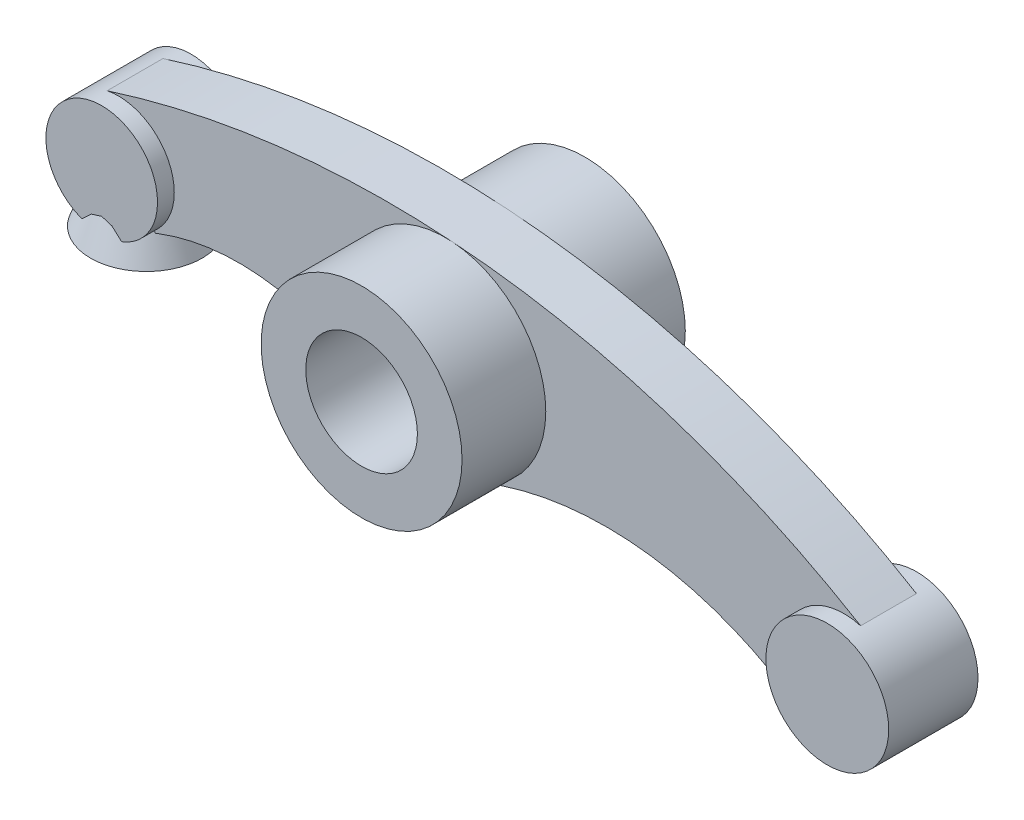
ISO-10303-21;
HEADER;
FILE_DESCRIPTION(('STEP AP214'),'2;1');
FILE_NAME('part.step','',(''),(''),'','','');
FILE_SCHEMA(('AUTOMOTIVE_DESIGN { 1 0 10303 214 1 1 1 1 }'));
ENDSEC;
DATA;
#1=APPLICATION_CONTEXT('core data for automotive mechanical design processes');
#2=APPLICATION_PROTOCOL_DEFINITION('international standard','automotive_design',2000,#1);
#3=PRODUCT_CONTEXT('',#1,'mechanical');
#4=PRODUCT('Part','Part','',(#3));
#5=PRODUCT_RELATED_PRODUCT_CATEGORY('part','',(#4));
#6=PRODUCT_DEFINITION_FORMATION('','',#4);
#7=PRODUCT_DEFINITION_CONTEXT('part definition',#1,'design');
#8=PRODUCT_DEFINITION('design','',#6,#7);
#9=PRODUCT_DEFINITION_SHAPE('','',#8);
#10=(LENGTH_UNIT() NAMED_UNIT(*) SI_UNIT(.MILLI.,.METRE.));
#11=(NAMED_UNIT(*) PLANE_ANGLE_UNIT() SI_UNIT($,.RADIAN.));
#12=(NAMED_UNIT(*) SI_UNIT($,.STERADIAN.) SOLID_ANGLE_UNIT());
#13=UNCERTAINTY_MEASURE_WITH_UNIT(LENGTH_MEASURE(1.E-05),#10,'distance_accuracy_value','');
#14=(GEOMETRIC_REPRESENTATION_CONTEXT(3) GLOBAL_UNCERTAINTY_ASSIGNED_CONTEXT((#13)) GLOBAL_UNIT_ASSIGNED_CONTEXT((#10,
#11,#12)) REPRESENTATION_CONTEXT('',''));
#15=CARTESIAN_POINT('',(0.,0.,0.));
#16=DIRECTION('',(0.,0.,1.));
#17=DIRECTION('',(1.,0.,0.));
#18=AXIS2_PLACEMENT_3D('',#15,#16,#17);
#19=CARTESIAN_POINT('',(-29.2802079968478,-6.,0.));
#20=DIRECTION('',(0.,-1.,0.));
#21=DIRECTION('',(0.,0.,1.));
#22=AXIS2_PLACEMENT_3D('',#19,#20,#21);
#23=CONICAL_SURFACE('',#22,5.,0.349065850398868);
#24=CARTESIAN_POINT('',(-29.2802079968478,1.,0.));
#25=DIRECTION('',(0.,1.,0.));
#26=DIRECTION('',(0.,0.,1.));
#27=AXIS2_PLACEMENT_3D('',#24,#25,#26);
#28=CIRCLE('',#27,2.45220836013657);
#29=CARTESIAN_POINT('',(-29.2802079968478,1.,2.45220836013657));
#30=VERTEX_POINT('',#29);
#31=EDGE_CURVE('E11',#30,#30,#28,.T.);
#32=ORIENTED_EDGE('',*,*,#31,.F.);
#33=EDGE_LOOP('',(#32));
#34=FACE_BOUND('',#33,.T.);
#35=CARTESIAN_POINT('',(-29.2802079968478,-6.,0.));
#36=DIRECTION('',(0.,1.,0.));
#37=DIRECTION('',(0.,0.,1.));
#38=AXIS2_PLACEMENT_3D('',#35,#36,#37);
#39=CIRCLE('',#38,5.);
#40=CARTESIAN_POINT('',(-29.2802079968478,-6.,5.));
#41=VERTEX_POINT('',#40);
#42=EDGE_CURVE('E52',#41,#41,#39,.T.);
#43=ORIENTED_EDGE('',*,*,#42,.T.);
#44=EDGE_LOOP('',(#43));
#45=FACE_BOUND('',#44,.T.);
#46=ADVANCED_FACE('F46',(#34,#45),#23,.T.);
#47=CARTESIAN_POINT('',(-29.2802079968478,1.,0.));
#48=DIRECTION('',(0.,1.,0.));
#49=DIRECTION('',(0.,0.,1.));
#50=AXIS2_PLACEMENT_3D('',#47,#48,#49);
#51=PLANE('',#50);
#52=ORIENTED_EDGE('',*,*,#31,.T.);
#53=EDGE_LOOP('',(#52));
#54=FACE_BOUND('',#53,.T.);
#55=ADVANCED_FACE('F61',(#54),#51,.T.);
#56=CARTESIAN_POINT('',(-29.2802079968478,-6.,0.));
#57=DIRECTION('',(0.,1.,0.));
#58=DIRECTION('',(0.,0.,1.));
#59=AXIS2_PLACEMENT_3D('',#56,#57,#58);
#60=PLANE('',#59);
#61=ORIENTED_EDGE('',*,*,#42,.F.);
#62=EDGE_LOOP('',(#61));
#63=FACE_BOUND('',#62,.T.);
#64=ADVANCED_FACE('F59',(#63),#60,.F.);
#65=CLOSED_SHELL('',(#46,#55,#64));
#66=MANIFOLD_SOLID_BREP('B2',#65);
#67=CARTESIAN_POINT('',(-5.1144524966079,-73.1815002282677,2.5));
#68=DIRECTION('',(0.,0.,-1.));
#69=DIRECTION('',(-1.,0.,0.));
#70=AXIS2_PLACEMENT_3D('',#67,#68,#69);
#71=CYLINDRICAL_SURFACE('',#70,82.36);
#72=CARTESIAN_POINT('',(-5.1144524966079,-73.1815002282677,-2.5));
#73=DIRECTION('',(0.,0.,1.));
#74=DIRECTION('',(1.,0.,0.));
#75=AXIS2_PLACEMENT_3D('',#72,#73,#74);
#76=CIRCLE('',#75,82.36);
#77=CARTESIAN_POINT('',(-30.2955174092308,5.2345923157138,-2.5));
#78=VERTEX_POINT('',#77);
#79=CARTESIAN_POINT('',(0.627454641077849,8.97810117304262,-2.5));
#80=VERTEX_POINT('',#79);
#81=EDGE_CURVE('E182',#78,#80,#76,.F.);
#82=ORIENTED_EDGE('',*,*,#81,.F.);
#83=DIRECTION('',(0.,0.,-1.));
#84=VECTOR('',#83,1.);
#85=CARTESIAN_POINT('',(-30.2955174092308,5.23459231571385,0.));
#86=LINE('',#85,#84);
#87=CARTESIAN_POINT('',(-30.2955174092308,5.2345923157138,2.5));
#88=VERTEX_POINT('',#87);
#89=EDGE_CURVE('E44',#78,#88,#86,.F.);
#90=ORIENTED_EDGE('',*,*,#89,.T.);
#91=CARTESIAN_POINT('',(-5.1144524966079,-73.1815002282677,2.5));
#92=DIRECTION('',(0.,0.,1.));
#93=DIRECTION('',(1.,0.,0.));
#94=AXIS2_PLACEMENT_3D('',#91,#92,#93);
#95=CIRCLE('',#94,82.36);
#96=CARTESIAN_POINT('',(0.627454641077849,8.97810117304262,2.5));
#97=VERTEX_POINT('',#96);
#98=EDGE_CURVE('E100',#88,#97,#95,.F.);
#99=ORIENTED_EDGE('',*,*,#98,.T.);
#100=CARTESIAN_POINT('',(37.2052077756992,-2.52588506261709,2.5));
#101=VERTEX_POINT('',#100);
#102=EDGE_CURVE('E187',#97,#101,#95,.F.);
#103=ORIENTED_EDGE('',*,*,#102,.T.);
#104=DIRECTION('',(0.,0.,-1.));
#105=VECTOR('',#104,1.);
#106=CARTESIAN_POINT('',(37.2052077756991,-2.52588506261706,2.5));
#107=LINE('',#106,#105);
#108=CARTESIAN_POINT('',(37.2052077756991,-2.52588506261706,-2.5));
#109=VERTEX_POINT('',#108);
#110=EDGE_CURVE('E177',#101,#109,#107,.T.);
#111=ORIENTED_EDGE('',*,*,#110,.T.);
#112=EDGE_CURVE('E184',#80,#109,#76,.F.);
#113=ORIENTED_EDGE('',*,*,#112,.F.);
#114=EDGE_LOOP('',(#82,#90,#99,#103,#111,#113));
#115=FACE_BOUND('',#114,.T.);
#116=ADVANCED_FACE('F86',(#115),#71,.T.);
#117=CARTESIAN_POINT('',(0.,0.,2.5));
#118=DIRECTION('',(0.,0.,1.));
#119=DIRECTION('',(1.,0.,0.));
#120=AXIS2_PLACEMENT_3D('',#117,#118,#119);
#121=PLANE('',#120);
#122=CARTESIAN_POINT('',(14.4326611027123,-36.2311474986499,2.5));
#123=DIRECTION('',(0.,0.,1.));
#124=DIRECTION('',(1.,0.,0.));
#125=AXIS2_PLACEMENT_3D('',#122,#123,#124);
#126=CIRCLE('',#125,30.);
#127=CARTESIAN_POINT('',(32.4217858073094,-12.2229948757917,2.5));
#128=VERTEX_POINT('',#127);
#129=CARTESIAN_POINT('',(3.34915168821614,-8.3536329204316,2.5));
#130=VERTEX_POINT('',#129);
#131=EDGE_CURVE('E188',#128,#130,#126,.T.);
#132=ORIENTED_EDGE('',*,*,#131,.F.);
#133=CARTESIAN_POINT('',(35.7197920031522,-7.82150022826769,2.5));
#134=DIRECTION('',(0.,0.,1.));
#135=DIRECTION('',(1.,0.,0.));
#136=AXIS2_PLACEMENT_3D('',#133,#134,#135);
#137=CIRCLE('',#136,5.5);
#138=EDGE_CURVE('E207',#128,#101,#137,.F.);
#139=ORIENTED_EDGE('',*,*,#138,.T.);
#140=ORIENTED_EDGE('',*,*,#102,.F.);
#141=CARTESIAN_POINT('',(0.,0.,2.5));
#142=DIRECTION('',(0.,0.,1.));
#143=DIRECTION('',(1.,0.,0.));
#144=AXIS2_PLACEMENT_3D('',#141,#142,#143);
#145=CIRCLE('',#144,8.99999999999997);
#146=EDGE_CURVE('E108',#97,#130,#145,.F.);
#147=ORIENTED_EDGE('',*,*,#146,.T.);
#148=EDGE_LOOP('',(#132,#139,#140,#147));
#149=FACE_BOUND('',#148,.T.);
#150=ADVANCED_FACE('F243',(#149),#121,.T.);
#151=CARTESIAN_POINT('',(0.,0.,-2.5));
#152=DIRECTION('',(0.,0.,1.));
#153=DIRECTION('',(1.,0.,0.));
#154=AXIS2_PLACEMENT_3D('',#151,#152,#153);
#155=PLANE('',#154);
#156=CARTESIAN_POINT('',(35.7197920031522,-7.82150022826769,-2.5));
#157=DIRECTION('',(0.,0.,1.));
#158=DIRECTION('',(1.,0.,0.));
#159=AXIS2_PLACEMENT_3D('',#156,#157,#158);
#160=CIRCLE('',#159,5.5);
#161=CARTESIAN_POINT('',(32.4217858073094,-12.2229948757917,-2.5));
#162=VERTEX_POINT('',#161);
#163=EDGE_CURVE('E212',#162,#109,#160,.F.);
#164=ORIENTED_EDGE('',*,*,#163,.F.);
#165=CARTESIAN_POINT('',(14.4326611027123,-36.2311474986499,-2.5));
#166=DIRECTION('',(0.,0.,1.));
#167=DIRECTION('',(1.,0.,0.));
#168=AXIS2_PLACEMENT_3D('',#165,#166,#167);
#169=CIRCLE('',#168,30.);
#170=CARTESIAN_POINT('',(3.34915168821614,-8.3536329204316,-2.5));
#171=VERTEX_POINT('',#170);
#172=EDGE_CURVE('E165',#162,#171,#169,.T.);
#173=ORIENTED_EDGE('',*,*,#172,.T.);
#174=CARTESIAN_POINT('',(0.,0.,-2.5));
#175=DIRECTION('',(0.,0.,1.));
#176=DIRECTION('',(1.,0.,0.));
#177=AXIS2_PLACEMENT_3D('',#174,#175,#176);
#178=CIRCLE('',#177,8.99999999999997);
#179=EDGE_CURVE('E172',#80,#171,#178,.F.);
#180=ORIENTED_EDGE('',*,*,#179,.F.);
#181=ORIENTED_EDGE('',*,*,#112,.T.);
#182=EDGE_LOOP('',(#164,#173,#180,#181));
#183=FACE_BOUND('',#182,.T.);
#184=ADVANCED_FACE('F248',(#183),#155,.F.);
#185=CARTESIAN_POINT('',(-18.4794070711714,-22.2076936855671,2.5));
#186=DIRECTION('',(0.,0.,-1.));
#187=DIRECTION('',(-1.,0.,0.));
#188=AXIS2_PLACEMENT_3D('',#185,#186,#187);
#189=CYLINDRICAL_SURFACE('',#188,20.);
#190=DIRECTION('',(0.,0.,-1.));
#191=VECTOR('',#190,1.);
#192=CARTESIAN_POINT('',(-6.60254719634098,-6.11607476410232,0.));
#193=LINE('',#192,#191);
#194=CARTESIAN_POINT('',(-6.60254719634098,-6.11607476410232,2.5));
#195=VERTEX_POINT('',#194);
#196=CARTESIAN_POINT('',(-6.60254719634098,-6.11607476410232,-2.5));
#197=VERTEX_POINT('',#196);
#198=EDGE_CURVE('E192',#195,#197,#193,.T.);
#199=ORIENTED_EDGE('',*,*,#198,.F.);
#200=CARTESIAN_POINT('',(-18.4794070711714,-22.2076936855671,2.5));
#201=DIRECTION('',(0.,0.,1.));
#202=DIRECTION('',(1.,0.,0.));
#203=AXIS2_PLACEMENT_3D('',#200,#201,#202);
#204=CIRCLE('',#203,20.);
#205=CARTESIAN_POINT('',(-27.1200478117125,-4.17052850938435,2.5));
#206=VERTEX_POINT('',#205);
#207=EDGE_CURVE('E171',#206,#195,#204,.F.);
#208=ORIENTED_EDGE('',*,*,#207,.F.);
#209=DIRECTION('',(0.,0.,-1.));
#210=VECTOR('',#209,1.);
#211=CARTESIAN_POINT('',(-27.1200478117125,-4.17052850938431,2.5));
#212=LINE('',#211,#210);
#213=CARTESIAN_POINT('',(-27.1200478117125,-4.17052850938435,-2.5));
#214=VERTEX_POINT('',#213);
#215=EDGE_CURVE('E153',#206,#214,#212,.T.);
#216=ORIENTED_EDGE('',*,*,#215,.T.);
#217=CARTESIAN_POINT('',(-18.4794070711714,-22.2076936855671,-2.5));
#218=DIRECTION('',(0.,0.,1.));
#219=DIRECTION('',(1.,0.,0.));
#220=AXIS2_PLACEMENT_3D('',#217,#218,#219);
#221=CIRCLE('',#220,20.);
#222=EDGE_CURVE('E160',#214,#197,#221,.F.);
#223=ORIENTED_EDGE('',*,*,#222,.T.);
#224=EDGE_LOOP('',(#199,#208,#216,#223));
#225=FACE_BOUND('',#224,.T.);
#226=ADVANCED_FACE('F169',(#225),#189,.F.);
#227=CARTESIAN_POINT('',(14.4326611027123,-36.2311474986499,2.5));
#228=DIRECTION('',(0.,0.,-1.));
#229=DIRECTION('',(-1.,0.,0.));
#230=AXIS2_PLACEMENT_3D('',#227,#228,#229);
#231=CYLINDRICAL_SURFACE('',#230,30.);
#232=ORIENTED_EDGE('',*,*,#131,.T.);
#233=DIRECTION('',(0.,0.,-1.));
#234=VECTOR('',#233,1.);
#235=CARTESIAN_POINT('',(3.34915168821614,-8.35363292043159,0.));
#236=LINE('',#235,#234);
#237=EDGE_CURVE('E194',#130,#171,#236,.T.);
#238=ORIENTED_EDGE('',*,*,#237,.T.);
#239=ORIENTED_EDGE('',*,*,#172,.F.);
#240=DIRECTION('',(0.,0.,-1.));
#241=VECTOR('',#240,1.);
#242=CARTESIAN_POINT('',(32.4217858073094,-12.2229948757917,2.5));
#243=LINE('',#242,#241);
#244=EDGE_CURVE('E173',#128,#162,#243,.T.);
#245=ORIENTED_EDGE('',*,*,#244,.F.);
#246=EDGE_LOOP('',(#232,#238,#239,#245));
#247=FACE_BOUND('',#246,.T.);
#248=ADVANCED_FACE('F257',(#247),#231,.F.);
#249=ORIENTED_EDGE('',*,*,#98,.F.);
#250=CARTESIAN_POINT('',(-29.2802079968478,0.338762784661341,2.5));
#251=DIRECTION('',(0.,0.,1.));
#252=DIRECTION('',(1.,0.,0.));
#253=AXIS2_PLACEMENT_3D('',#250,#251,#252);
#254=CIRCLE('',#253,4.99999999999995);
#255=EDGE_CURVE('E156',#88,#206,#254,.F.);
#256=ORIENTED_EDGE('',*,*,#255,.T.);
#257=ORIENTED_EDGE('',*,*,#207,.T.);
#258=EDGE_CURVE('E166',#195,#97,#145,.F.);
#259=ORIENTED_EDGE('',*,*,#258,.T.);
#260=EDGE_LOOP('',(#249,#256,#257,#259));
#261=FACE_BOUND('',#260,.T.);
#262=ADVANCED_FACE('F250',(#261),#121,.T.);
#263=CARTESIAN_POINT('',(-29.2802079968478,0.338762784661341,-2.5));
#264=DIRECTION('',(0.,0.,1.));
#265=DIRECTION('',(1.,0.,0.));
#266=AXIS2_PLACEMENT_3D('',#263,#264,#265);
#267=CIRCLE('',#266,4.99999999999995);
#268=EDGE_CURVE('E148',#78,#214,#267,.F.);
#269=ORIENTED_EDGE('',*,*,#268,.F.);
#270=ORIENTED_EDGE('',*,*,#81,.T.);
#271=EDGE_CURVE('E94',#197,#80,#178,.F.);
#272=ORIENTED_EDGE('',*,*,#271,.F.);
#273=ORIENTED_EDGE('',*,*,#222,.F.);
#274=EDGE_LOOP('',(#269,#270,#272,#273));
#275=FACE_BOUND('',#274,.T.);
#276=ADVANCED_FACE('F161',(#275),#155,.F.);
#277=CARTESIAN_POINT('',(-29.2802079968478,0.338762784661341,2.5));
#278=DIRECTION('',(0.,0.,-1.));
#279=DIRECTION('',(-1.,0.,0.));
#280=AXIS2_PLACEMENT_3D('',#277,#278,#279);
#281=CYLINDRICAL_SURFACE('',#280,4.99999999999995);
#282=ORIENTED_EDGE('',*,*,#215,.F.);
#283=ORIENTED_EDGE('',*,*,#255,.F.);
#284=ORIENTED_EDGE('',*,*,#89,.F.);
#285=ORIENTED_EDGE('',*,*,#268,.T.);
#286=EDGE_LOOP('',(#282,#283,#284,#285));
#287=FACE_BOUND('',#286,.T.);
#288=CARTESIAN_POINT('',(-29.2802079968478,0.338762784661341,4.));
#289=DIRECTION('',(0.,0.,1.));
#290=DIRECTION('',(1.,0.,0.));
#291=AXIS2_PLACEMENT_3D('',#288,#289,#290);
#292=CIRCLE('',#291,4.99999999999995);
#293=CARTESIAN_POINT('',(-24.2802079968478,0.338762784661341,4.));
#294=VERTEX_POINT('',#293);
#295=EDGE_CURVE('E157',#294,#294,#292,.T.);
#296=ORIENTED_EDGE('',*,*,#295,.F.);
#297=EDGE_LOOP('',(#296));
#298=FACE_BOUND('',#297,.T.);
#299=CARTESIAN_POINT('',(-29.2802079968478,0.338762784661341,-4.));
#300=DIRECTION('',(0.,0.,1.));
#301=DIRECTION('',(1.,0.,0.));
#302=AXIS2_PLACEMENT_3D('',#299,#300,#301);
#303=CIRCLE('',#302,4.99999999999995);
#304=CARTESIAN_POINT('',(-24.2802079968478,0.338762784661341,-4.));
#305=VERTEX_POINT('',#304);
#306=EDGE_CURVE('E221',#305,#305,#303,.T.);
#307=ORIENTED_EDGE('',*,*,#306,.T.);
#308=EDGE_LOOP('',(#307));
#309=FACE_BOUND('',#308,.T.);
#310=ADVANCED_FACE('F150',(#287,#298,#309),#281,.T.);
#311=CARTESIAN_POINT('',(35.7197920031522,-7.82150022826769,2.5));
#312=DIRECTION('',(0.,0.,-1.));
#313=DIRECTION('',(-1.,0.,0.));
#314=AXIS2_PLACEMENT_3D('',#311,#312,#313);
#315=CYLINDRICAL_SURFACE('',#314,5.5);
#316=ORIENTED_EDGE('',*,*,#244,.T.);
#317=ORIENTED_EDGE('',*,*,#163,.T.);
#318=ORIENTED_EDGE('',*,*,#110,.F.);
#319=ORIENTED_EDGE('',*,*,#138,.F.);
#320=EDGE_LOOP('',(#316,#317,#318,#319));
#321=FACE_BOUND('',#320,.T.);
#322=CARTESIAN_POINT('',(35.7197920031522,-7.82150022826769,-4.));
#323=DIRECTION('',(0.,0.,1.));
#324=DIRECTION('',(1.,0.,0.));
#325=AXIS2_PLACEMENT_3D('',#322,#323,#324);
#326=CIRCLE('',#325,5.5);
#327=CARTESIAN_POINT('',(41.2197920031522,-7.82150022826769,-4.));
#328=VERTEX_POINT('',#327);
#329=EDGE_CURVE('E215',#328,#328,#326,.T.);
#330=ORIENTED_EDGE('',*,*,#329,.T.);
#331=EDGE_LOOP('',(#330));
#332=FACE_BOUND('',#331,.T.);
#333=CARTESIAN_POINT('',(35.7197920031522,-7.82150022826769,4.));
#334=DIRECTION('',(0.,0.,1.));
#335=DIRECTION('',(1.,0.,0.));
#336=AXIS2_PLACEMENT_3D('',#333,#334,#335);
#337=CIRCLE('',#336,5.5);
#338=CARTESIAN_POINT('',(41.2197920031522,-7.82150022826769,4.));
#339=VERTEX_POINT('',#338);
#340=EDGE_CURVE('E214',#339,#339,#337,.T.);
#341=ORIENTED_EDGE('',*,*,#340,.F.);
#342=EDGE_LOOP('',(#341));
#343=FACE_BOUND('',#342,.T.);
#344=ADVANCED_FACE('F230',(#321,#332,#343),#315,.T.);
#345=CARTESIAN_POINT('',(0.,0.,10.));
#346=DIRECTION('',(0.,0.,1.));
#347=DIRECTION('',(1.,0.,0.));
#348=AXIS2_PLACEMENT_3D('',#345,#346,#347);
#349=PLANE('',#348);
#350=CARTESIAN_POINT('',(0.,0.,10.));
#351=DIRECTION('',(0.,0.,1.));
#352=DIRECTION('',(1.,0.,0.));
#353=AXIS2_PLACEMENT_3D('',#350,#351,#352);
#354=CIRCLE('',#353,8.99999999999997);
#355=CARTESIAN_POINT('',(8.99999999999997,0.,10.));
#356=VERTEX_POINT('',#355);
#357=EDGE_CURVE('E197',#356,#356,#354,.T.);
#358=ORIENTED_EDGE('',*,*,#357,.T.);
#359=EDGE_LOOP('',(#358));
#360=FACE_BOUND('',#359,.T.);
#361=CARTESIAN_POINT('',(0.,0.,10.));
#362=DIRECTION('',(0.,0.,1.));
#363=DIRECTION('',(1.,0.,0.));
#364=AXIS2_PLACEMENT_3D('',#361,#362,#363);
#365=CIRCLE('',#364,5.);
#366=CARTESIAN_POINT('',(5.,0.,10.));
#367=VERTEX_POINT('',#366);
#368=EDGE_CURVE('E201',#367,#367,#365,.T.);
#369=ORIENTED_EDGE('',*,*,#368,.F.);
#370=EDGE_LOOP('',(#369));
#371=FACE_BOUND('',#370,.T.);
#372=ADVANCED_FACE('F255',(#360,#371),#349,.T.);
#373=CARTESIAN_POINT('',(0.,0.,-10.));
#374=DIRECTION('',(0.,0.,1.));
#375=DIRECTION('',(1.,0.,0.));
#376=AXIS2_PLACEMENT_3D('',#373,#374,#375);
#377=PLANE('',#376);
#378=CARTESIAN_POINT('',(0.,0.,-10.));
#379=DIRECTION('',(0.,0.,1.));
#380=DIRECTION('',(1.,0.,0.));
#381=AXIS2_PLACEMENT_3D('',#378,#379,#380);
#382=CIRCLE('',#381,8.99999999999997);
#383=CARTESIAN_POINT('',(8.99999999999997,0.,-10.));
#384=VERTEX_POINT('',#383);
#385=EDGE_CURVE('E198',#384,#384,#382,.T.);
#386=ORIENTED_EDGE('',*,*,#385,.F.);
#387=EDGE_LOOP('',(#386));
#388=FACE_BOUND('',#387,.T.);
#389=CARTESIAN_POINT('',(0.,0.,-10.));
#390=DIRECTION('',(0.,0.,1.));
#391=DIRECTION('',(1.,0.,0.));
#392=AXIS2_PLACEMENT_3D('',#389,#390,#391);
#393=CIRCLE('',#392,5.);
#394=CARTESIAN_POINT('',(5.,0.,-10.));
#395=VERTEX_POINT('',#394);
#396=EDGE_CURVE('E204',#395,#395,#393,.T.);
#397=ORIENTED_EDGE('',*,*,#396,.T.);
#398=EDGE_LOOP('',(#397));
#399=FACE_BOUND('',#398,.T.);
#400=ADVANCED_FACE('F281',(#388,#399),#377,.F.);
#401=CARTESIAN_POINT('',(0.,0.,2.5));
#402=DIRECTION('',(0.,0.,-1.));
#403=DIRECTION('',(-1.,0.,0.));
#404=AXIS2_PLACEMENT_3D('',#401,#402,#403);
#405=CYLINDRICAL_SURFACE('',#404,5.);
#406=ORIENTED_EDGE('',*,*,#396,.F.);
#407=EDGE_LOOP('',(#406));
#408=FACE_BOUND('',#407,.T.);
#409=ORIENTED_EDGE('',*,*,#368,.T.);
#410=EDGE_LOOP('',(#409));
#411=FACE_BOUND('',#410,.T.);
#412=ADVANCED_FACE('F88',(#408,#411),#405,.F.);
#413=CARTESIAN_POINT('',(0.,0.,2.5));
#414=DIRECTION('',(0.,0.,-1.));
#415=DIRECTION('',(-1.,0.,0.));
#416=AXIS2_PLACEMENT_3D('',#413,#414,#415);
#417=CYLINDRICAL_SURFACE('',#416,8.99999999999999);
#418=ORIENTED_EDGE('',*,*,#258,.F.);
#419=ORIENTED_EDGE('',*,*,#198,.T.);
#420=ORIENTED_EDGE('',*,*,#271,.T.);
#421=ORIENTED_EDGE('',*,*,#179,.T.);
#422=ORIENTED_EDGE('',*,*,#237,.F.);
#423=ORIENTED_EDGE('',*,*,#146,.F.);
#424=EDGE_LOOP('',(#418,#419,#420,#421,#422,#423));
#425=FACE_BOUND('',#424,.T.);
#426=ORIENTED_EDGE('',*,*,#357,.F.);
#427=EDGE_LOOP('',(#426));
#428=FACE_BOUND('',#427,.T.);
#429=ORIENTED_EDGE('',*,*,#385,.T.);
#430=EDGE_LOOP('',(#429));
#431=FACE_BOUND('',#430,.T.);
#432=ADVANCED_FACE('F261',(#425,#428,#431),#417,.T.);
#433=CARTESIAN_POINT('',(35.7197920031522,-7.82150022826769,-4.));
#434=DIRECTION('',(0.,0.,1.));
#435=DIRECTION('',(1.,0.,0.));
#436=AXIS2_PLACEMENT_3D('',#433,#434,#435);
#437=PLANE('',#436);
#438=ORIENTED_EDGE('',*,*,#329,.F.);
#439=EDGE_LOOP('',(#438));
#440=FACE_BOUND('',#439,.T.);
#441=ADVANCED_FACE('F264',(#440),#437,.F.);
#442=CARTESIAN_POINT('',(35.7197920031522,-7.82150022826769,4.));
#443=DIRECTION('',(0.,0.,1.));
#444=DIRECTION('',(1.,0.,0.));
#445=AXIS2_PLACEMENT_3D('',#442,#443,#444);
#446=PLANE('',#445);
#447=ORIENTED_EDGE('',*,*,#340,.T.);
#448=EDGE_LOOP('',(#447));
#449=FACE_BOUND('',#448,.T.);
#450=ADVANCED_FACE('F239',(#449),#446,.T.);
#451=CARTESIAN_POINT('',(-29.2802079968478,0.338762784661341,4.));
#452=DIRECTION('',(0.,0.,1.));
#453=DIRECTION('',(1.,0.,0.));
#454=AXIS2_PLACEMENT_3D('',#451,#452,#453);
#455=PLANE('',#454);
#456=ORIENTED_EDGE('',*,*,#295,.T.);
#457=EDGE_LOOP('',(#456));
#458=FACE_BOUND('',#457,.T.);
#459=ADVANCED_FACE('F227',(#458),#455,.T.);
#460=CARTESIAN_POINT('',(-29.2802079968478,0.338762784661341,-4.));
#461=DIRECTION('',(0.,0.,1.));
#462=DIRECTION('',(1.,0.,0.));
#463=AXIS2_PLACEMENT_3D('',#460,#461,#462);
#464=PLANE('',#463);
#465=ORIENTED_EDGE('',*,*,#306,.F.);
#466=EDGE_LOOP('',(#465));
#467=FACE_BOUND('',#466,.T.);
#468=ADVANCED_FACE('F233',(#467),#464,.F.);
#469=CLOSED_SHELL('',(#116,#150,#184,#226,#248,#262,#276,#310,#344,#372,#400,#412,#432,#441,
#450,#459,#468));
#470=MANIFOLD_SOLID_BREP('B6',#469);
#471=ADVANCED_BREP_SHAPE_REPRESENTATION('',(#18,#66,#470),#14);
#472=SHAPE_DEFINITION_REPRESENTATION(#9,#471);
ENDSEC;
END-ISO-10303-21;
